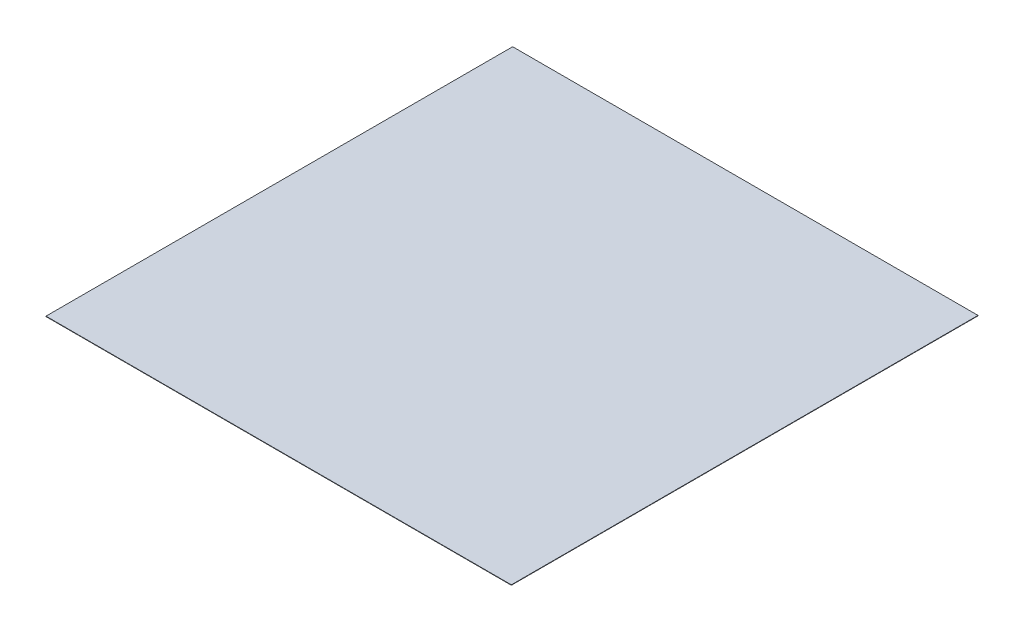
ISO-10303-21;
HEADER;
FILE_DESCRIPTION(('STEP AP214'),'2;1');
FILE_NAME('part.step','',(''),(''),'','','');
FILE_SCHEMA(('AUTOMOTIVE_DESIGN { 1 0 10303 214 1 1 1 1 }'));
ENDSEC;
DATA;
#1=APPLICATION_CONTEXT('core data for automotive mechanical design processes');
#2=APPLICATION_PROTOCOL_DEFINITION('international standard','automotive_design',2000,#1);
#3=PRODUCT_CONTEXT('',#1,'mechanical');
#4=PRODUCT('Part','Part','',(#3));
#5=PRODUCT_RELATED_PRODUCT_CATEGORY('part','',(#4));
#6=PRODUCT_DEFINITION_FORMATION('','',#4);
#7=PRODUCT_DEFINITION_CONTEXT('part definition',#1,'design');
#8=PRODUCT_DEFINITION('design','',#6,#7);
#9=PRODUCT_DEFINITION_SHAPE('','',#8);
#10=(LENGTH_UNIT() NAMED_UNIT(*) SI_UNIT(.MILLI.,.METRE.));
#11=(NAMED_UNIT(*) PLANE_ANGLE_UNIT() SI_UNIT($,.RADIAN.));
#12=(NAMED_UNIT(*) SI_UNIT($,.STERADIAN.) SOLID_ANGLE_UNIT());
#13=UNCERTAINTY_MEASURE_WITH_UNIT(LENGTH_MEASURE(1.E-05),#10,'distance_accuracy_value','');
#14=(GEOMETRIC_REPRESENTATION_CONTEXT(3) GLOBAL_UNCERTAINTY_ASSIGNED_CONTEXT((#13)) GLOBAL_UNIT_ASSIGNED_CONTEXT((#10,
#11,#12)) REPRESENTATION_CONTEXT('',''));
#15=CARTESIAN_POINT('',(0.,0.,0.));
#16=DIRECTION('',(0.,0.,1.));
#17=DIRECTION('',(1.,0.,0.));
#18=AXIS2_PLACEMENT_3D('',#15,#16,#17);
#19=CARTESIAN_POINT('',(453.,-0.8,454.25));
#20=DIRECTION('',(1.,0.,0.));
#21=DIRECTION('',(0.,0.,-1.));
#22=AXIS2_PLACEMENT_3D('',#19,#20,#21);
#23=PLANE('',#22);
#24=DIRECTION('',(0.,0.,-1.));
#25=VECTOR('',#24,1.);
#26=CARTESIAN_POINT('',(453.,0.,454.25));
#27=LINE('',#26,#25);
#28=CARTESIAN_POINT('',(453.,0.,454.25));
#29=VERTEX_POINT('',#28);
#30=CARTESIAN_POINT('',(453.,0.,-454.25));
#31=VERTEX_POINT('',#30);
#32=EDGE_CURVE('E97',#29,#31,#27,.T.);
#33=ORIENTED_EDGE('',*,*,#32,.F.);
#34=DIRECTION('',(0.,1.,0.));
#35=VECTOR('',#34,1.);
#36=CARTESIAN_POINT('',(453.,-0.8,454.25));
#37=LINE('',#36,#35);
#38=CARTESIAN_POINT('',(453.,-0.8,454.25));
#39=VERTEX_POINT('',#38);
#40=EDGE_CURVE('E11',#39,#29,#37,.T.);
#41=ORIENTED_EDGE('',*,*,#40,.F.);
#42=DIRECTION('',(0.,0.,-1.));
#43=VECTOR('',#42,1.);
#44=CARTESIAN_POINT('',(453.,-0.8,454.25));
#45=LINE('',#44,#43);
#46=CARTESIAN_POINT('',(453.,-0.8,-454.25));
#47=VERTEX_POINT('',#46);
#48=EDGE_CURVE('E91',#39,#47,#45,.T.);
#49=ORIENTED_EDGE('',*,*,#48,.T.);
#50=DIRECTION('',(0.,1.,0.));
#51=VECTOR('',#50,1.);
#52=CARTESIAN_POINT('',(453.,-0.8,-454.25));
#53=LINE('',#52,#51);
#54=EDGE_CURVE('E36',#47,#31,#53,.T.);
#55=ORIENTED_EDGE('',*,*,#54,.T.);
#56=EDGE_LOOP('',(#33,#41,#49,#55));
#57=FACE_BOUND('',#56,.T.);
#58=ADVANCED_FACE('F33',(#57),#23,.T.);
#59=CARTESIAN_POINT('',(-453.,-0.8,454.25));
#60=DIRECTION('',(0.,0.,1.));
#61=DIRECTION('',(1.,0.,0.));
#62=AXIS2_PLACEMENT_3D('',#59,#60,#61);
#63=PLANE('',#62);
#64=DIRECTION('',(1.,0.,0.));
#65=VECTOR('',#64,1.);
#66=CARTESIAN_POINT('',(-453.,0.,454.25));
#67=LINE('',#66,#65);
#68=CARTESIAN_POINT('',(-453.,0.,454.25));
#69=VERTEX_POINT('',#68);
#70=EDGE_CURVE('E93',#69,#29,#67,.T.);
#71=ORIENTED_EDGE('',*,*,#70,.F.);
#72=DIRECTION('',(0.,1.,0.));
#73=VECTOR('',#72,1.);
#74=CARTESIAN_POINT('',(-453.,-0.8,454.25));
#75=LINE('',#74,#73);
#76=CARTESIAN_POINT('',(-453.,-0.8,454.25));
#77=VERTEX_POINT('',#76);
#78=EDGE_CURVE('E42',#77,#69,#75,.T.);
#79=ORIENTED_EDGE('',*,*,#78,.F.);
#80=DIRECTION('',(1.,0.,0.));
#81=VECTOR('',#80,1.);
#82=CARTESIAN_POINT('',(-453.,-0.8,454.25));
#83=LINE('',#82,#81);
#84=EDGE_CURVE('E88',#77,#39,#83,.T.);
#85=ORIENTED_EDGE('',*,*,#84,.T.);
#86=ORIENTED_EDGE('',*,*,#40,.T.);
#87=EDGE_LOOP('',(#71,#79,#85,#86));
#88=FACE_BOUND('',#87,.T.);
#89=ADVANCED_FACE('F107',(#88),#63,.T.);
#90=CARTESIAN_POINT('',(-453.,-0.8,454.25));
#91=DIRECTION('',(-1.,0.,0.));
#92=DIRECTION('',(0.,0.,1.));
#93=AXIS2_PLACEMENT_3D('',#90,#91,#92);
#94=PLANE('',#93);
#95=DIRECTION('',(0.,0.,1.));
#96=VECTOR('',#95,1.);
#97=CARTESIAN_POINT('',(-453.,0.,454.25));
#98=LINE('',#97,#96);
#99=CARTESIAN_POINT('',(-453.,0.,-454.25));
#100=VERTEX_POINT('',#99);
#101=EDGE_CURVE('E83',#100,#69,#98,.T.);
#102=ORIENTED_EDGE('',*,*,#101,.F.);
#103=DIRECTION('',(0.,1.,0.));
#104=VECTOR('',#103,1.);
#105=CARTESIAN_POINT('',(-453.,-0.8,-454.25));
#106=LINE('',#105,#104);
#107=CARTESIAN_POINT('',(-453.,-0.8,-454.25));
#108=VERTEX_POINT('',#107);
#109=EDGE_CURVE('E78',#108,#100,#106,.T.);
#110=ORIENTED_EDGE('',*,*,#109,.F.);
#111=DIRECTION('',(0.,0.,1.));
#112=VECTOR('',#111,1.);
#113=CARTESIAN_POINT('',(-453.,-0.8,454.25));
#114=LINE('',#113,#112);
#115=EDGE_CURVE('E81',#108,#77,#114,.T.);
#116=ORIENTED_EDGE('',*,*,#115,.T.);
#117=ORIENTED_EDGE('',*,*,#78,.T.);
#118=EDGE_LOOP('',(#102,#110,#116,#117));
#119=FACE_BOUND('',#118,.T.);
#120=ADVANCED_FACE('F80',(#119),#94,.T.);
#121=CARTESIAN_POINT('',(-453.,-0.8,-454.25));
#122=DIRECTION('',(0.,0.,-1.));
#123=DIRECTION('',(-1.,0.,0.));
#124=AXIS2_PLACEMENT_3D('',#121,#122,#123);
#125=PLANE('',#124);
#126=DIRECTION('',(-1.,0.,0.));
#127=VECTOR('',#126,1.);
#128=CARTESIAN_POINT('',(-453.,0.,-454.25));
#129=LINE('',#128,#127);
#130=EDGE_CURVE('E100',#31,#100,#129,.T.);
#131=ORIENTED_EDGE('',*,*,#130,.F.);
#132=ORIENTED_EDGE('',*,*,#54,.F.);
#133=DIRECTION('',(-1.,0.,0.));
#134=VECTOR('',#133,1.);
#135=CARTESIAN_POINT('',(-453.,-0.8,-454.25));
#136=LINE('',#135,#134);
#137=EDGE_CURVE('E87',#47,#108,#136,.T.);
#138=ORIENTED_EDGE('',*,*,#137,.T.);
#139=ORIENTED_EDGE('',*,*,#109,.T.);
#140=EDGE_LOOP('',(#131,#132,#138,#139));
#141=FACE_BOUND('',#140,.T.);
#142=ADVANCED_FACE('F90',(#141),#125,.T.);
#143=CARTESIAN_POINT('',(453.,-0.8,-454.25));
#144=DIRECTION('',(0.,-1.,0.));
#145=DIRECTION('',(0.,0.,-1.));
#146=AXIS2_PLACEMENT_3D('',#143,#144,#145);
#147=PLANE('',#146);
#148=ORIENTED_EDGE('',*,*,#48,.F.);
#149=ORIENTED_EDGE('',*,*,#84,.F.);
#150=ORIENTED_EDGE('',*,*,#115,.F.);
#151=ORIENTED_EDGE('',*,*,#137,.F.);
#152=EDGE_LOOP('',(#148,#149,#150,#151));
#153=FACE_BOUND('',#152,.T.);
#154=ADVANCED_FACE('F86',(#153),#147,.T.);
#155=CARTESIAN_POINT('',(453.,0.,-454.25));
#156=DIRECTION('',(0.,-1.,0.));
#157=DIRECTION('',(0.,0.,-1.));
#158=AXIS2_PLACEMENT_3D('',#155,#156,#157);
#159=PLANE('',#158);
#160=ORIENTED_EDGE('',*,*,#32,.T.);
#161=ORIENTED_EDGE('',*,*,#130,.T.);
#162=ORIENTED_EDGE('',*,*,#101,.T.);
#163=ORIENTED_EDGE('',*,*,#70,.T.);
#164=EDGE_LOOP('',(#160,#161,#162,#163));
#165=FACE_BOUND('',#164,.T.);
#166=ADVANCED_FACE('F106',(#165),#159,.F.);
#167=CLOSED_SHELL('',(#58,#89,#120,#142,#154,#166));
#168=MANIFOLD_SOLID_BREP('B2',#167);
#169=ADVANCED_BREP_SHAPE_REPRESENTATION('',(#18,#168),#14);
#170=SHAPE_DEFINITION_REPRESENTATION(#9,#169);
ENDSEC;
END-ISO-10303-21;
